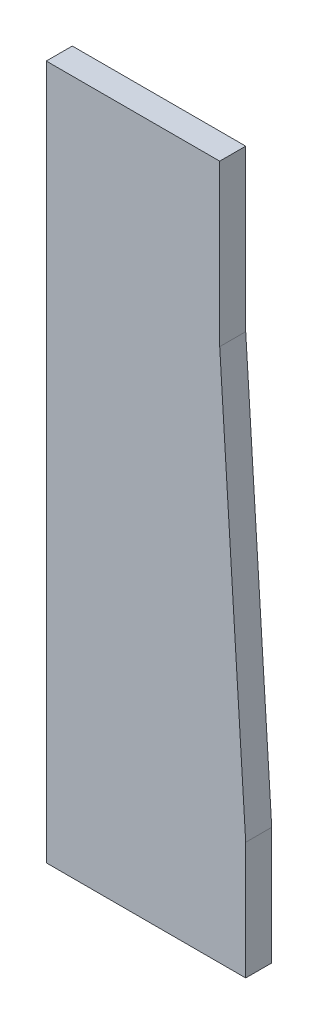
ISO-10303-21;
HEADER;
FILE_DESCRIPTION(('STEP AP214'),'2;1');
FILE_NAME('part.step','',(''),(''),'','','');
FILE_SCHEMA(('AUTOMOTIVE_DESIGN { 1 0 10303 214 1 1 1 1 }'));
ENDSEC;
DATA;
#1=APPLICATION_CONTEXT('core data for automotive mechanical design processes');
#2=APPLICATION_PROTOCOL_DEFINITION('international standard','automotive_design',2000,#1);
#3=PRODUCT_CONTEXT('',#1,'mechanical');
#4=PRODUCT('Part','Part','',(#3));
#5=PRODUCT_RELATED_PRODUCT_CATEGORY('part','',(#4));
#6=PRODUCT_DEFINITION_FORMATION('','',#4);
#7=PRODUCT_DEFINITION_CONTEXT('part definition',#1,'design');
#8=PRODUCT_DEFINITION('design','',#6,#7);
#9=PRODUCT_DEFINITION_SHAPE('','',#8);
#10=(LENGTH_UNIT() NAMED_UNIT(*) SI_UNIT(.MILLI.,.METRE.));
#11=(NAMED_UNIT(*) PLANE_ANGLE_UNIT() SI_UNIT($,.RADIAN.));
#12=(NAMED_UNIT(*) SI_UNIT($,.STERADIAN.) SOLID_ANGLE_UNIT());
#13=UNCERTAINTY_MEASURE_WITH_UNIT(LENGTH_MEASURE(1.E-05),#10,'distance_accuracy_value','');
#14=(GEOMETRIC_REPRESENTATION_CONTEXT(3) GLOBAL_UNCERTAINTY_ASSIGNED_CONTEXT((#13)) GLOBAL_UNIT_ASSIGNED_CONTEXT((#10,
#11,#12)) REPRESENTATION_CONTEXT('',''));
#15=CARTESIAN_POINT('',(0.,0.,0.));
#16=DIRECTION('',(0.,0.,1.));
#17=DIRECTION('',(1.,0.,0.));
#18=AXIS2_PLACEMENT_3D('',#15,#16,#17);
#19=CARTESIAN_POINT('',(209.03946,-5024.87840407149,19.05));
#20=DIRECTION('',(0.,-1.,0.));
#21=DIRECTION('',(0.,0.,-1.));
#22=AXIS2_PLACEMENT_3D('',#19,#20,#21);
#23=PLANE('',#22);
#24=DIRECTION('',(-1.,0.,0.));
#25=VECTOR('',#24,1.);
#26=CARTESIAN_POINT('',(209.03946,-5024.87840407149,0.));
#27=LINE('',#26,#25);
#28=CARTESIAN_POINT('',(209.03946,-5024.87840407149,0.));
#29=VERTEX_POINT('',#28);
#30=CARTESIAN_POINT('',(82.03946,-5024.87840407149,0.));
#31=VERTEX_POINT('',#30);
#32=EDGE_CURVE('E117',#29,#31,#27,.T.);
#33=ORIENTED_EDGE('',*,*,#32,.T.);
#34=DIRECTION('',(0.,0.,-1.));
#35=VECTOR('',#34,1.);
#36=CARTESIAN_POINT('',(82.03946,-5024.87840407149,19.05));
#37=LINE('',#36,#35);
#38=CARTESIAN_POINT('',(82.03946,-5024.87840407149,19.05));
#39=VERTEX_POINT('',#38);
#40=EDGE_CURVE('E11',#39,#31,#37,.T.);
#41=ORIENTED_EDGE('',*,*,#40,.F.);
#42=DIRECTION('',(-1.,0.,0.));
#43=VECTOR('',#42,1.);
#44=CARTESIAN_POINT('',(209.03946,-5024.87840407149,19.05));
#45=LINE('',#44,#43);
#46=CARTESIAN_POINT('',(209.03946,-5024.87840407149,19.05));
#47=VERTEX_POINT('',#46);
#48=EDGE_CURVE('E127',#47,#39,#45,.T.);
#49=ORIENTED_EDGE('',*,*,#48,.F.);
#50=DIRECTION('',(0.,0.,-1.));
#51=VECTOR('',#50,1.);
#52=CARTESIAN_POINT('',(209.03946,-5024.87840407149,19.05));
#53=LINE('',#52,#51);
#54=EDGE_CURVE('E113',#47,#29,#53,.T.);
#55=ORIENTED_EDGE('',*,*,#54,.T.);
#56=EDGE_LOOP('',(#33,#41,#49,#55));
#57=FACE_BOUND('',#56,.T.);
#58=ADVANCED_FACE('F33',(#57),#23,.F.);
#59=CARTESIAN_POINT('',(82.03946,-5024.87840407149,19.05));
#60=DIRECTION('',(1.,0.,0.));
#61=DIRECTION('',(0.,1.,0.));
#62=AXIS2_PLACEMENT_3D('',#59,#60,#61);
#63=PLANE('',#62);
#64=DIRECTION('',(0.,-1.,0.));
#65=VECTOR('',#64,1.);
#66=CARTESIAN_POINT('',(82.03946,-5024.87840407149,0.));
#67=LINE('',#66,#65);
#68=CARTESIAN_POINT('',(82.03946,-5533.41550298787,0.));
#69=VERTEX_POINT('',#68);
#70=EDGE_CURVE('E120',#31,#69,#67,.T.);
#71=ORIENTED_EDGE('',*,*,#70,.T.);
#72=DIRECTION('',(0.,0.,-1.));
#73=VECTOR('',#72,1.);
#74=CARTESIAN_POINT('',(82.03946,-5533.41550298787,19.05));
#75=LINE('',#74,#73);
#76=CARTESIAN_POINT('',(82.03946,-5533.41550298787,19.05));
#77=VERTEX_POINT('',#76);
#78=EDGE_CURVE('E41',#77,#69,#75,.T.);
#79=ORIENTED_EDGE('',*,*,#78,.F.);
#80=DIRECTION('',(0.,-1.,0.));
#81=VECTOR('',#80,1.);
#82=CARTESIAN_POINT('',(82.03946,-5024.87840407149,19.05));
#83=LINE('',#82,#81);
#84=EDGE_CURVE('E86',#39,#77,#83,.T.);
#85=ORIENTED_EDGE('',*,*,#84,.F.);
#86=ORIENTED_EDGE('',*,*,#40,.T.);
#87=EDGE_LOOP('',(#71,#79,#85,#86));
#88=FACE_BOUND('',#87,.T.);
#89=ADVANCED_FACE('F151',(#88),#63,.F.);
#90=CARTESIAN_POINT('',(82.03946,-5533.41550298787,19.05));
#91=DIRECTION('',(0.,1.,0.));
#92=DIRECTION('',(0.,0.,1.));
#93=AXIS2_PLACEMENT_3D('',#90,#91,#92);
#94=PLANE('',#93);
#95=DIRECTION('',(1.,0.,0.));
#96=VECTOR('',#95,1.);
#97=CARTESIAN_POINT('',(82.03946,-5533.41550298787,0.));
#98=LINE('',#97,#96);
#99=CARTESIAN_POINT('',(228.088766336441,-5533.41550298787,0.));
#100=VERTEX_POINT('',#99);
#101=EDGE_CURVE('E122',#69,#100,#98,.T.);
#102=ORIENTED_EDGE('',*,*,#101,.T.);
#103=DIRECTION('',(0.,0.,-1.));
#104=VECTOR('',#103,1.);
#105=CARTESIAN_POINT('',(228.088766336441,-5533.41550298787,19.05));
#106=LINE('',#105,#104);
#107=CARTESIAN_POINT('',(228.088766336441,-5533.41550298787,19.05));
#108=VERTEX_POINT('',#107);
#109=EDGE_CURVE('E108',#108,#100,#106,.T.);
#110=ORIENTED_EDGE('',*,*,#109,.F.);
#111=DIRECTION('',(1.,0.,0.));
#112=VECTOR('',#111,1.);
#113=CARTESIAN_POINT('',(82.03946,-5533.41550298787,19.05));
#114=LINE('',#113,#112);
#115=EDGE_CURVE('E99',#77,#108,#114,.T.);
#116=ORIENTED_EDGE('',*,*,#115,.F.);
#117=ORIENTED_EDGE('',*,*,#78,.T.);
#118=EDGE_LOOP('',(#102,#110,#116,#117));
#119=FACE_BOUND('',#118,.T.);
#120=ADVANCED_FACE('F133',(#119),#94,.F.);
#121=CARTESIAN_POINT('',(228.088766336441,-5533.41550298787,19.05));
#122=DIRECTION('',(-1.,0.,0.));
#123=DIRECTION('',(0.,0.,1.));
#124=AXIS2_PLACEMENT_3D('',#121,#122,#123);
#125=PLANE('',#124);
#126=DIRECTION('',(0.,1.,0.));
#127=VECTOR('',#126,1.);
#128=CARTESIAN_POINT('',(228.088766336441,-5533.41550298787,0.));
#129=LINE('',#128,#127);
#130=CARTESIAN_POINT('',(228.088766336441,-5447.34166837047,0.));
#131=VERTEX_POINT('',#130);
#132=EDGE_CURVE('E107',#100,#131,#129,.T.);
#133=ORIENTED_EDGE('',*,*,#132,.T.);
#134=DIRECTION('',(0.,0.,-1.));
#135=VECTOR('',#134,1.);
#136=CARTESIAN_POINT('',(228.088766336441,-5447.34166837047,19.05));
#137=LINE('',#136,#135);
#138=CARTESIAN_POINT('',(228.088766336441,-5447.34166837047,19.05));
#139=VERTEX_POINT('',#138);
#140=EDGE_CURVE('E104',#139,#131,#137,.T.);
#141=ORIENTED_EDGE('',*,*,#140,.F.);
#142=DIRECTION('',(0.,1.,0.));
#143=VECTOR('',#142,1.);
#144=CARTESIAN_POINT('',(228.088766336441,-5533.41550298787,19.05));
#145=LINE('',#144,#143);
#146=EDGE_CURVE('E93',#108,#139,#145,.T.);
#147=ORIENTED_EDGE('',*,*,#146,.F.);
#148=ORIENTED_EDGE('',*,*,#109,.T.);
#149=EDGE_LOOP('',(#133,#141,#147,#148));
#150=FACE_BOUND('',#149,.T.);
#151=ADVANCED_FACE('F105',(#150),#125,.F.);
#152=CARTESIAN_POINT('',(228.088766336441,-5447.34166837047,19.05));
#153=DIRECTION('',(-0.998052578482889,-0.0623782861551806,0.));
#154=DIRECTION('',(0.0623782861551806,-0.998052578482889,0.));
#155=AXIS2_PLACEMENT_3D('',#152,#153,#154);
#156=PLANE('',#155);
#157=DIRECTION('',(-0.0623782861551806,0.998052578482889,0.));
#158=VECTOR('',#157,1.);
#159=CARTESIAN_POINT('',(228.088766336441,-5447.34166837047,0.));
#160=LINE('',#159,#158);
#161=CARTESIAN_POINT('',(209.03946,-5142.55276698741,0.));
#162=VERTEX_POINT('',#161);
#163=EDGE_CURVE('E72',#131,#162,#160,.T.);
#164=ORIENTED_EDGE('',*,*,#163,.T.);
#165=DIRECTION('',(0.,0.,-1.));
#166=VECTOR('',#165,1.);
#167=CARTESIAN_POINT('',(209.03946,-5142.55276698741,19.05));
#168=LINE('',#167,#166);
#169=CARTESIAN_POINT('',(209.03946,-5142.55276698741,19.05));
#170=VERTEX_POINT('',#169);
#171=EDGE_CURVE('E109',#170,#162,#168,.T.);
#172=ORIENTED_EDGE('',*,*,#171,.F.);
#173=DIRECTION('',(-0.0623782861551806,0.998052578482889,0.));
#174=VECTOR('',#173,1.);
#175=CARTESIAN_POINT('',(228.088766336441,-5447.34166837047,19.05));
#176=LINE('',#175,#174);
#177=EDGE_CURVE('E97',#139,#170,#176,.T.);
#178=ORIENTED_EDGE('',*,*,#177,.F.);
#179=ORIENTED_EDGE('',*,*,#140,.T.);
#180=EDGE_LOOP('',(#164,#172,#178,#179));
#181=FACE_BOUND('',#180,.T.);
#182=ADVANCED_FACE('F111',(#181),#156,.F.);
#183=CARTESIAN_POINT('',(209.03946,-5142.55276698741,19.05));
#184=DIRECTION('',(-1.,0.,0.));
#185=DIRECTION('',(0.,0.,1.));
#186=AXIS2_PLACEMENT_3D('',#183,#184,#185);
#187=PLANE('',#186);
#188=DIRECTION('',(0.,1.,0.));
#189=VECTOR('',#188,1.);
#190=CARTESIAN_POINT('',(209.03946,-5142.55276698741,0.));
#191=LINE('',#190,#189);
#192=EDGE_CURVE('E78',#162,#29,#191,.T.);
#193=ORIENTED_EDGE('',*,*,#192,.T.);
#194=ORIENTED_EDGE('',*,*,#54,.F.);
#195=DIRECTION('',(0.,1.,0.));
#196=VECTOR('',#195,1.);
#197=CARTESIAN_POINT('',(209.03946,-5142.55276698741,19.05));
#198=LINE('',#197,#196);
#199=EDGE_CURVE('E49',#170,#47,#198,.T.);
#200=ORIENTED_EDGE('',*,*,#199,.F.);
#201=ORIENTED_EDGE('',*,*,#171,.T.);
#202=EDGE_LOOP('',(#193,#194,#200,#201));
#203=FACE_BOUND('',#202,.T.);
#204=ADVANCED_FACE('F140',(#203),#187,.F.);
#205=CARTESIAN_POINT('',(0.,0.,19.05));
#206=DIRECTION('',(0.,0.,1.));
#207=DIRECTION('',(1.,0.,0.));
#208=AXIS2_PLACEMENT_3D('',#205,#206,#207);
#209=PLANE('',#208);
#210=ORIENTED_EDGE('',*,*,#48,.T.);
#211=ORIENTED_EDGE('',*,*,#84,.T.);
#212=ORIENTED_EDGE('',*,*,#115,.T.);
#213=ORIENTED_EDGE('',*,*,#146,.T.);
#214=ORIENTED_EDGE('',*,*,#177,.T.);
#215=ORIENTED_EDGE('',*,*,#199,.T.);
#216=EDGE_LOOP('',(#210,#211,#212,#213,#214,#215));
#217=FACE_BOUND('',#216,.T.);
#218=ADVANCED_FACE('F95',(#217),#209,.T.);
#219=CARTESIAN_POINT('',(0.,0.,0.));
#220=DIRECTION('',(0.,0.,1.));
#221=DIRECTION('',(1.,0.,0.));
#222=AXIS2_PLACEMENT_3D('',#219,#220,#221);
#223=PLANE('',#222);
#224=ORIENTED_EDGE('',*,*,#32,.F.);
#225=ORIENTED_EDGE('',*,*,#192,.F.);
#226=ORIENTED_EDGE('',*,*,#163,.F.);
#227=ORIENTED_EDGE('',*,*,#132,.F.);
#228=ORIENTED_EDGE('',*,*,#101,.F.);
#229=ORIENTED_EDGE('',*,*,#70,.F.);
#230=EDGE_LOOP('',(#224,#225,#226,#227,#228,#229));
#231=FACE_BOUND('',#230,.T.);
#232=ADVANCED_FACE('F136',(#231),#223,.F.);
#233=CLOSED_SHELL('',(#58,#89,#120,#151,#182,#204,#218,#232));
#234=MANIFOLD_SOLID_BREP('B2',#233);
#235=ADVANCED_BREP_SHAPE_REPRESENTATION('',(#18,#234),#14);
#236=SHAPE_DEFINITION_REPRESENTATION(#9,#235);
ENDSEC;
END-ISO-10303-21;
